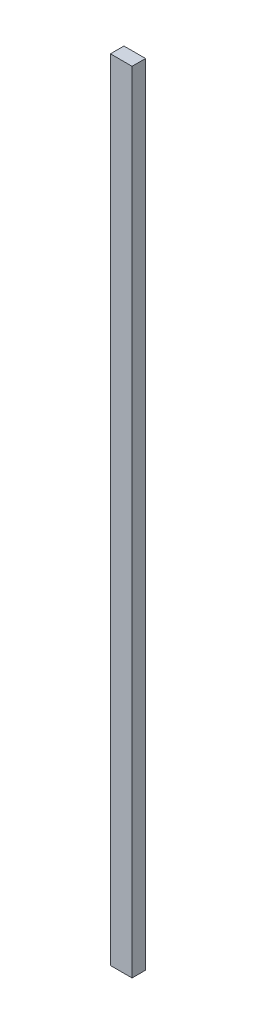
ISO-10303-21;
HEADER;
FILE_DESCRIPTION(('STEP AP214'),'2;1');
FILE_NAME('part.step','',(''),(''),'','','');
FILE_SCHEMA(('AUTOMOTIVE_DESIGN { 1 0 10303 214 1 1 1 1 }'));
ENDSEC;
DATA;
#1=APPLICATION_CONTEXT('core data for automotive mechanical design processes');
#2=APPLICATION_PROTOCOL_DEFINITION('international standard','automotive_design',2000,#1);
#3=PRODUCT_CONTEXT('',#1,'mechanical');
#4=PRODUCT('Part','Part','',(#3));
#5=PRODUCT_RELATED_PRODUCT_CATEGORY('part','',(#4));
#6=PRODUCT_DEFINITION_FORMATION('','',#4);
#7=PRODUCT_DEFINITION_CONTEXT('part definition',#1,'design');
#8=PRODUCT_DEFINITION('design','',#6,#7);
#9=PRODUCT_DEFINITION_SHAPE('','',#8);
#10=(LENGTH_UNIT() NAMED_UNIT(*) SI_UNIT(.MILLI.,.METRE.));
#11=(NAMED_UNIT(*) PLANE_ANGLE_UNIT() SI_UNIT($,.RADIAN.));
#12=(NAMED_UNIT(*) SI_UNIT($,.STERADIAN.) SOLID_ANGLE_UNIT());
#13=UNCERTAINTY_MEASURE_WITH_UNIT(LENGTH_MEASURE(1.E-05),#10,'distance_accuracy_value','');
#14=(GEOMETRIC_REPRESENTATION_CONTEXT(3) GLOBAL_UNCERTAINTY_ASSIGNED_CONTEXT((#13)) GLOBAL_UNIT_ASSIGNED_CONTEXT((#10,
#11,#12)) REPRESENTATION_CONTEXT('',''));
#15=CARTESIAN_POINT('',(0.,0.,0.));
#16=DIRECTION('',(0.,0.,1.));
#17=DIRECTION('',(1.,0.,0.));
#18=AXIS2_PLACEMENT_3D('',#15,#16,#17);
#19=CARTESIAN_POINT('',(1290.,200.,-752.));
#20=DIRECTION('',(-1.,0.,0.));
#21=DIRECTION('',(0.,0.,1.));
#22=AXIS2_PLACEMENT_3D('',#19,#20,#21);
#23=PLANE('',#22);
#24=DIRECTION('',(0.,-1.,0.));
#25=VECTOR('',#24,1.);
#26=CARTESIAN_POINT('',(1290.,200.,-727.));
#27=LINE('',#26,#25);
#28=CARTESIAN_POINT('',(1290.,1660.,-727.));
#29=VERTEX_POINT('',#28);
#30=CARTESIAN_POINT('',(1290.,200.,-727.));
#31=VERTEX_POINT('',#30);
#32=EDGE_CURVE('E103',#29,#31,#27,.T.);
#33=ORIENTED_EDGE('',*,*,#32,.F.);
#34=DIRECTION('',(0.,0.,1.));
#35=VECTOR('',#34,1.);
#36=CARTESIAN_POINT('',(1290.,1660.,-752.));
#37=LINE('',#36,#35);
#38=CARTESIAN_POINT('',(1290.,1660.,-752.));
#39=VERTEX_POINT('',#38);
#40=EDGE_CURVE('E11',#39,#29,#37,.T.);
#41=ORIENTED_EDGE('',*,*,#40,.F.);
#42=DIRECTION('',(0.,-1.,0.));
#43=VECTOR('',#42,1.);
#44=CARTESIAN_POINT('',(1290.,200.,-752.));
#45=LINE('',#44,#43);
#46=CARTESIAN_POINT('',(1290.,200.,-752.));
#47=VERTEX_POINT('',#46);
#48=EDGE_CURVE('E97',#39,#47,#45,.T.);
#49=ORIENTED_EDGE('',*,*,#48,.T.);
#50=DIRECTION('',(0.,0.,1.));
#51=VECTOR('',#50,1.);
#52=CARTESIAN_POINT('',(1290.,200.,-752.));
#53=LINE('',#52,#51);
#54=EDGE_CURVE('E42',#47,#31,#53,.T.);
#55=ORIENTED_EDGE('',*,*,#54,.T.);
#56=EDGE_LOOP('',(#33,#41,#49,#55));
#57=FACE_BOUND('',#56,.T.);
#58=ADVANCED_FACE('F39',(#57),#23,.T.);
#59=CARTESIAN_POINT('',(1290.,1660.,-752.));
#60=DIRECTION('',(0.,1.,0.));
#61=DIRECTION('',(0.,0.,1.));
#62=AXIS2_PLACEMENT_3D('',#59,#60,#61);
#63=PLANE('',#62);
#64=DIRECTION('',(-1.,0.,0.));
#65=VECTOR('',#64,1.);
#66=CARTESIAN_POINT('',(1290.,1660.,-727.));
#67=LINE('',#66,#65);
#68=CARTESIAN_POINT('',(1330.,1660.,-727.));
#69=VERTEX_POINT('',#68);
#70=EDGE_CURVE('E99',#69,#29,#67,.T.);
#71=ORIENTED_EDGE('',*,*,#70,.F.);
#72=DIRECTION('',(0.,0.,1.));
#73=VECTOR('',#72,1.);
#74=CARTESIAN_POINT('',(1330.,1660.,-752.));
#75=LINE('',#74,#73);
#76=CARTESIAN_POINT('',(1330.,1660.,-752.));
#77=VERTEX_POINT('',#76);
#78=EDGE_CURVE('E48',#77,#69,#75,.T.);
#79=ORIENTED_EDGE('',*,*,#78,.F.);
#80=DIRECTION('',(-1.,0.,0.));
#81=VECTOR('',#80,1.);
#82=CARTESIAN_POINT('',(1290.,1660.,-752.));
#83=LINE('',#82,#81);
#84=EDGE_CURVE('E94',#77,#39,#83,.T.);
#85=ORIENTED_EDGE('',*,*,#84,.T.);
#86=ORIENTED_EDGE('',*,*,#40,.T.);
#87=EDGE_LOOP('',(#71,#79,#85,#86));
#88=FACE_BOUND('',#87,.T.);
#89=ADVANCED_FACE('F113',(#88),#63,.T.);
#90=CARTESIAN_POINT('',(1330.,200.,-752.));
#91=DIRECTION('',(1.,0.,0.));
#92=DIRECTION('',(0.,0.,-1.));
#93=AXIS2_PLACEMENT_3D('',#90,#91,#92);
#94=PLANE('',#93);
#95=DIRECTION('',(0.,1.,0.));
#96=VECTOR('',#95,1.);
#97=CARTESIAN_POINT('',(1330.,200.,-727.));
#98=LINE('',#97,#96);
#99=CARTESIAN_POINT('',(1330.,200.,-727.));
#100=VERTEX_POINT('',#99);
#101=EDGE_CURVE('E89',#100,#69,#98,.T.);
#102=ORIENTED_EDGE('',*,*,#101,.F.);
#103=DIRECTION('',(0.,0.,1.));
#104=VECTOR('',#103,1.);
#105=CARTESIAN_POINT('',(1330.,200.,-752.));
#106=LINE('',#105,#104);
#107=CARTESIAN_POINT('',(1330.,200.,-752.));
#108=VERTEX_POINT('',#107);
#109=EDGE_CURVE('E84',#108,#100,#106,.T.);
#110=ORIENTED_EDGE('',*,*,#109,.F.);
#111=DIRECTION('',(0.,1.,0.));
#112=VECTOR('',#111,1.);
#113=CARTESIAN_POINT('',(1330.,200.,-752.));
#114=LINE('',#113,#112);
#115=EDGE_CURVE('E87',#108,#77,#114,.T.);
#116=ORIENTED_EDGE('',*,*,#115,.T.);
#117=ORIENTED_EDGE('',*,*,#78,.T.);
#118=EDGE_LOOP('',(#102,#110,#116,#117));
#119=FACE_BOUND('',#118,.T.);
#120=ADVANCED_FACE('F86',(#119),#94,.T.);
#121=CARTESIAN_POINT('',(1290.,200.,-752.));
#122=DIRECTION('',(0.,-1.,0.));
#123=DIRECTION('',(0.,0.,-1.));
#124=AXIS2_PLACEMENT_3D('',#121,#122,#123);
#125=PLANE('',#124);
#126=DIRECTION('',(1.,0.,0.));
#127=VECTOR('',#126,1.);
#128=CARTESIAN_POINT('',(1290.,200.,-727.));
#129=LINE('',#128,#127);
#130=EDGE_CURVE('E106',#31,#100,#129,.T.);
#131=ORIENTED_EDGE('',*,*,#130,.F.);
#132=ORIENTED_EDGE('',*,*,#54,.F.);
#133=DIRECTION('',(1.,0.,0.));
#134=VECTOR('',#133,1.);
#135=CARTESIAN_POINT('',(1290.,200.,-752.));
#136=LINE('',#135,#134);
#137=EDGE_CURVE('E93',#47,#108,#136,.T.);
#138=ORIENTED_EDGE('',*,*,#137,.T.);
#139=ORIENTED_EDGE('',*,*,#109,.T.);
#140=EDGE_LOOP('',(#131,#132,#138,#139));
#141=FACE_BOUND('',#140,.T.);
#142=ADVANCED_FACE('F96',(#141),#125,.T.);
#143=CARTESIAN_POINT('',(0.,0.,-752.));
#144=DIRECTION('',(0.,0.,-1.));
#145=DIRECTION('',(-1.,0.,0.));
#146=AXIS2_PLACEMENT_3D('',#143,#144,#145);
#147=PLANE('',#146);
#148=ORIENTED_EDGE('',*,*,#48,.F.);
#149=ORIENTED_EDGE('',*,*,#84,.F.);
#150=ORIENTED_EDGE('',*,*,#115,.F.);
#151=ORIENTED_EDGE('',*,*,#137,.F.);
#152=EDGE_LOOP('',(#148,#149,#150,#151));
#153=FACE_BOUND('',#152,.T.);
#154=ADVANCED_FACE('F92',(#153),#147,.T.);
#155=CARTESIAN_POINT('',(0.,0.,-727.));
#156=DIRECTION('',(0.,0.,-1.));
#157=DIRECTION('',(-1.,0.,0.));
#158=AXIS2_PLACEMENT_3D('',#155,#156,#157);
#159=PLANE('',#158);
#160=ORIENTED_EDGE('',*,*,#32,.T.);
#161=ORIENTED_EDGE('',*,*,#130,.T.);
#162=ORIENTED_EDGE('',*,*,#101,.T.);
#163=ORIENTED_EDGE('',*,*,#70,.T.);
#164=EDGE_LOOP('',(#160,#161,#162,#163));
#165=FACE_BOUND('',#164,.T.);
#166=ADVANCED_FACE('F112',(#165),#159,.F.);
#167=CLOSED_SHELL('',(#58,#89,#120,#142,#154,#166));
#168=MANIFOLD_SOLID_BREP('B2',#167);
#169=ADVANCED_BREP_SHAPE_REPRESENTATION('',(#18,#168),#14);
#170=SHAPE_DEFINITION_REPRESENTATION(#9,#169);
ENDSEC;
END-ISO-10303-21;
